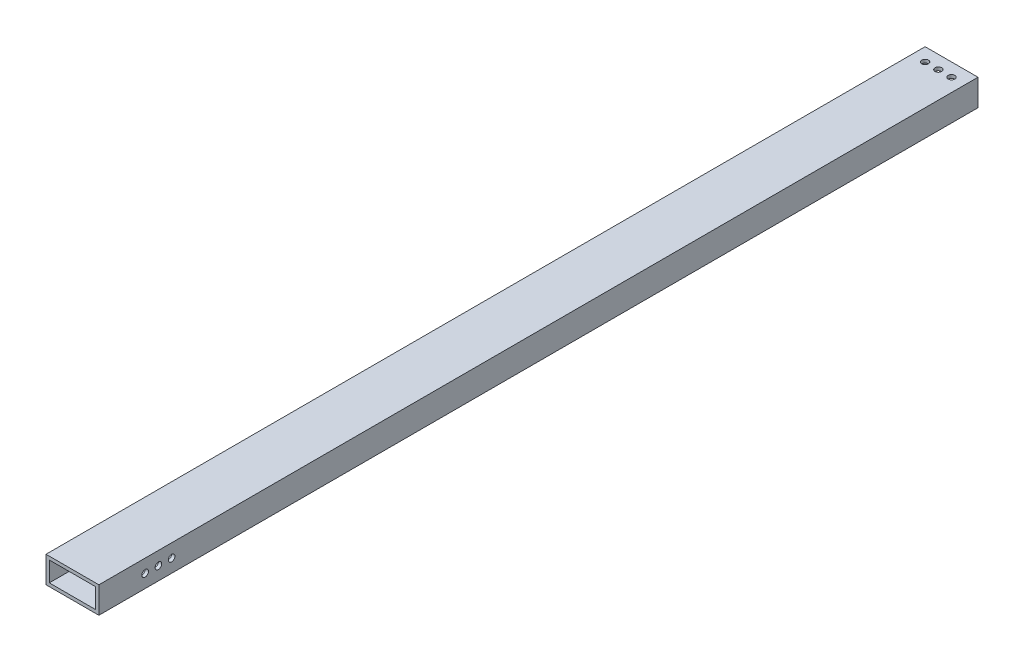
ISO-10303-21;
HEADER;
FILE_DESCRIPTION(('STEP AP214'),'2;1');
FILE_NAME('part.step','',(''),(''),'','','');
FILE_SCHEMA(('AUTOMOTIVE_DESIGN { 1 0 10303 214 1 1 1 1 }'));
ENDSEC;
DATA;
#1=APPLICATION_CONTEXT('core data for automotive mechanical design processes');
#2=APPLICATION_PROTOCOL_DEFINITION('international standard','automotive_design',2000,#1);
#3=PRODUCT_CONTEXT('',#1,'mechanical');
#4=PRODUCT('Part','Part','',(#3));
#5=PRODUCT_RELATED_PRODUCT_CATEGORY('part','',(#4));
#6=PRODUCT_DEFINITION_FORMATION('','',#4);
#7=PRODUCT_DEFINITION_CONTEXT('part definition',#1,'design');
#8=PRODUCT_DEFINITION('design','',#6,#7);
#9=PRODUCT_DEFINITION_SHAPE('','',#8);
#10=(LENGTH_UNIT() NAMED_UNIT(*) SI_UNIT(.MILLI.,.METRE.));
#11=(NAMED_UNIT(*) PLANE_ANGLE_UNIT() SI_UNIT($,.RADIAN.));
#12=(NAMED_UNIT(*) SI_UNIT($,.STERADIAN.) SOLID_ANGLE_UNIT());
#13=UNCERTAINTY_MEASURE_WITH_UNIT(LENGTH_MEASURE(1.E-05),#10,'distance_accuracy_value','');
#14=(GEOMETRIC_REPRESENTATION_CONTEXT(3) GLOBAL_UNCERTAINTY_ASSIGNED_CONTEXT((#13)) GLOBAL_UNIT_ASSIGNED_CONTEXT((#10,
#11,#12)) REPRESENTATION_CONTEXT('',''));
#15=CARTESIAN_POINT('',(0.,0.,0.));
#16=DIRECTION('',(0.,0.,1.));
#17=DIRECTION('',(1.,0.,0.));
#18=AXIS2_PLACEMENT_3D('',#15,#16,#17);
#19=CARTESIAN_POINT('',(0.,0.,844.55));
#20=DIRECTION('',(0.,0.,-1.));
#21=DIRECTION('',(-1.,0.,0.));
#22=AXIS2_PLACEMENT_3D('',#19,#20,#21);
#23=PLANE('',#22);
#24=DIRECTION('',(0.,-1.,0.));
#25=VECTOR('',#24,1.);
#26=CARTESIAN_POINT('',(0.,0.,844.55));
#27=LINE('',#26,#25);
#28=CARTESIAN_POINT('',(0.,25.4,844.55));
#29=VERTEX_POINT('',#28);
#30=CARTESIAN_POINT('',(0.,0.,844.55));
#31=VERTEX_POINT('',#30);
#32=EDGE_CURVE('E163',#29,#31,#27,.T.);
#33=ORIENTED_EDGE('',*,*,#32,.T.);
#34=DIRECTION('',(1.,0.,0.));
#35=VECTOR('',#34,1.);
#36=CARTESIAN_POINT('',(0.,0.,844.55));
#37=LINE('',#36,#35);
#38=CARTESIAN_POINT('',(50.8,0.,844.55));
#39=VERTEX_POINT('',#38);
#40=EDGE_CURVE('E167',#31,#39,#37,.T.);
#41=ORIENTED_EDGE('',*,*,#40,.T.);
#42=DIRECTION('',(0.,1.,0.));
#43=VECTOR('',#42,1.);
#44=CARTESIAN_POINT('',(50.8,0.,844.55));
#45=LINE('',#44,#43);
#46=CARTESIAN_POINT('',(50.8,25.4,844.55));
#47=VERTEX_POINT('',#46);
#48=EDGE_CURVE('E171',#39,#47,#45,.T.);
#49=ORIENTED_EDGE('',*,*,#48,.T.);
#50=DIRECTION('',(-1.,0.,0.));
#51=VECTOR('',#50,1.);
#52=CARTESIAN_POINT('',(0.,25.4,844.55));
#53=LINE('',#52,#51);
#54=EDGE_CURVE('E174',#47,#29,#53,.T.);
#55=ORIENTED_EDGE('',*,*,#54,.T.);
#56=EDGE_LOOP('',(#33,#41,#49,#55));
#57=FACE_BOUND('',#56,.T.);
#58=DIRECTION('',(0.,-1.,0.));
#59=VECTOR('',#58,1.);
#60=CARTESIAN_POINT('',(3.175,3.175,844.55));
#61=LINE('',#60,#59);
#62=CARTESIAN_POINT('',(3.175,22.225,844.55));
#63=VERTEX_POINT('',#62);
#64=CARTESIAN_POINT('',(3.175,3.175,844.55));
#65=VERTEX_POINT('',#64);
#66=EDGE_CURVE('E113',#63,#65,#61,.T.);
#67=ORIENTED_EDGE('',*,*,#66,.F.);
#68=DIRECTION('',(-1.,0.,0.));
#69=VECTOR('',#68,1.);
#70=CARTESIAN_POINT('',(3.175,22.225,844.55));
#71=LINE('',#70,#69);
#72=CARTESIAN_POINT('',(47.625,22.225,844.55));
#73=VERTEX_POINT('',#72);
#74=EDGE_CURVE('E139',#73,#63,#71,.T.);
#75=ORIENTED_EDGE('',*,*,#74,.F.);
#76=DIRECTION('',(0.,1.,0.));
#77=VECTOR('',#76,1.);
#78=CARTESIAN_POINT('',(47.625,3.175,844.55));
#79=LINE('',#78,#77);
#80=CARTESIAN_POINT('',(47.625,3.175,844.55));
#81=VERTEX_POINT('',#80);
#82=EDGE_CURVE('E135',#81,#73,#79,.T.);
#83=ORIENTED_EDGE('',*,*,#82,.F.);
#84=DIRECTION('',(1.,0.,0.));
#85=VECTOR('',#84,1.);
#86=CARTESIAN_POINT('',(3.175,3.175,844.55));
#87=LINE('',#86,#85);
#88=EDGE_CURVE('E122',#65,#81,#87,.T.);
#89=ORIENTED_EDGE('',*,*,#88,.F.);
#90=EDGE_LOOP('',(#67,#75,#83,#89));
#91=FACE_BOUND('',#90,.T.);
#92=ADVANCED_FACE('F45',(#57,#91),#23,.F.);
#93=CARTESIAN_POINT('',(0.,0.,0.));
#94=DIRECTION('',(0.,0.,-1.));
#95=DIRECTION('',(-1.,0.,0.));
#96=AXIS2_PLACEMENT_3D('',#93,#94,#95);
#97=PLANE('',#96);
#98=DIRECTION('',(0.,-1.,0.));
#99=VECTOR('',#98,1.);
#100=CARTESIAN_POINT('',(0.,0.,0.));
#101=LINE('',#100,#99);
#102=CARTESIAN_POINT('',(0.,25.4,0.));
#103=VERTEX_POINT('',#102);
#104=CARTESIAN_POINT('',(0.,0.,0.));
#105=VERTEX_POINT('',#104);
#106=EDGE_CURVE('E131',#103,#105,#101,.T.);
#107=ORIENTED_EDGE('',*,*,#106,.F.);
#108=DIRECTION('',(-1.,0.,0.));
#109=VECTOR('',#108,1.);
#110=CARTESIAN_POINT('',(0.,25.4,0.));
#111=LINE('',#110,#109);
#112=CARTESIAN_POINT('',(50.8,25.4,0.));
#113=VERTEX_POINT('',#112);
#114=EDGE_CURVE('E168',#113,#103,#111,.T.);
#115=ORIENTED_EDGE('',*,*,#114,.F.);
#116=DIRECTION('',(0.,1.,0.));
#117=VECTOR('',#116,1.);
#118=CARTESIAN_POINT('',(50.8,0.,0.));
#119=LINE('',#118,#117);
#120=CARTESIAN_POINT('',(50.8,0.,0.));
#121=VERTEX_POINT('',#120);
#122=EDGE_CURVE('E184',#121,#113,#119,.T.);
#123=ORIENTED_EDGE('',*,*,#122,.F.);
#124=DIRECTION('',(1.,0.,0.));
#125=VECTOR('',#124,1.);
#126=CARTESIAN_POINT('',(0.,0.,0.));
#127=LINE('',#126,#125);
#128=EDGE_CURVE('E181',#105,#121,#127,.T.);
#129=ORIENTED_EDGE('',*,*,#128,.F.);
#130=EDGE_LOOP('',(#107,#115,#123,#129));
#131=FACE_BOUND('',#130,.T.);
#132=DIRECTION('',(-1.,0.,0.));
#133=VECTOR('',#132,1.);
#134=CARTESIAN_POINT('',(3.175,22.225,0.));
#135=LINE('',#134,#133);
#136=CARTESIAN_POINT('',(47.625,22.225,0.));
#137=VERTEX_POINT('',#136);
#138=CARTESIAN_POINT('',(3.175,22.225,0.));
#139=VERTEX_POINT('',#138);
#140=EDGE_CURVE('E123',#137,#139,#135,.T.);
#141=ORIENTED_EDGE('',*,*,#140,.T.);
#142=DIRECTION('',(0.,-1.,0.));
#143=VECTOR('',#142,1.);
#144=CARTESIAN_POINT('',(3.175,3.175,0.));
#145=LINE('',#144,#143);
#146=CARTESIAN_POINT('',(3.175,3.175,0.));
#147=VERTEX_POINT('',#146);
#148=EDGE_CURVE('E71',#139,#147,#145,.T.);
#149=ORIENTED_EDGE('',*,*,#148,.T.);
#150=DIRECTION('',(1.,0.,0.));
#151=VECTOR('',#150,1.);
#152=CARTESIAN_POINT('',(3.175,3.175,0.));
#153=LINE('',#152,#151);
#154=CARTESIAN_POINT('',(47.625,3.175,0.));
#155=VERTEX_POINT('',#154);
#156=EDGE_CURVE('E129',#147,#155,#153,.T.);
#157=ORIENTED_EDGE('',*,*,#156,.T.);
#158=DIRECTION('',(0.,1.,0.));
#159=VECTOR('',#158,1.);
#160=CARTESIAN_POINT('',(47.625,3.175,0.));
#161=LINE('',#160,#159);
#162=EDGE_CURVE('E150',#155,#137,#161,.T.);
#163=ORIENTED_EDGE('',*,*,#162,.T.);
#164=EDGE_LOOP('',(#141,#149,#157,#163));
#165=FACE_BOUND('',#164,.T.);
#166=ADVANCED_FACE('F308',(#131,#165),#97,.T.);
#167=CARTESIAN_POINT('',(0.,0.,844.55));
#168=DIRECTION('',(1.,0.,0.));
#169=DIRECTION('',(0.,0.,-1.));
#170=AXIS2_PLACEMENT_3D('',#167,#168,#169);
#171=PLANE('',#170);
#172=CARTESIAN_POINT('',(0.,12.7,800.1));
#173=DIRECTION('',(1.,0.,0.));
#174=DIRECTION('',(0.,0.,-1.));
#175=AXIS2_PLACEMENT_3D('',#172,#173,#174);
#176=CIRCLE('',#175,3.17500000000008);
#177=CARTESIAN_POINT('',(0.,12.7,796.925));
#178=VERTEX_POINT('',#177);
#179=EDGE_CURVE('E204',#178,#178,#176,.T.);
#180=ORIENTED_EDGE('',*,*,#179,.T.);
#181=EDGE_LOOP('',(#180));
#182=FACE_BOUND('',#181,.T.);
#183=CARTESIAN_POINT('',(0.,12.7,787.4));
#184=DIRECTION('',(1.,0.,0.));
#185=DIRECTION('',(0.,0.,-1.));
#186=AXIS2_PLACEMENT_3D('',#183,#184,#185);
#187=CIRCLE('',#186,3.17500000000008);
#188=CARTESIAN_POINT('',(0.,12.7,784.225));
#189=VERTEX_POINT('',#188);
#190=EDGE_CURVE('E258',#189,#189,#187,.T.);
#191=ORIENTED_EDGE('',*,*,#190,.T.);
#192=EDGE_LOOP('',(#191));
#193=FACE_BOUND('',#192,.T.);
#194=CARTESIAN_POINT('',(0.,12.7,774.7));
#195=DIRECTION('',(1.,0.,0.));
#196=DIRECTION('',(0.,0.,-1.));
#197=AXIS2_PLACEMENT_3D('',#194,#195,#196);
#198=CIRCLE('',#197,3.17500000000008);
#199=CARTESIAN_POINT('',(0.,12.7,771.525));
#200=VERTEX_POINT('',#199);
#201=EDGE_CURVE('E254',#200,#200,#198,.T.);
#202=ORIENTED_EDGE('',*,*,#201,.T.);
#203=EDGE_LOOP('',(#202));
#204=FACE_BOUND('',#203,.T.);
#205=ORIENTED_EDGE('',*,*,#106,.T.);
#206=DIRECTION('',(0.,0.,-1.));
#207=VECTOR('',#206,1.);
#208=CARTESIAN_POINT('',(0.,0.,844.55));
#209=LINE('',#208,#207);
#210=EDGE_CURVE('E11',#31,#105,#209,.T.);
#211=ORIENTED_EDGE('',*,*,#210,.F.);
#212=ORIENTED_EDGE('',*,*,#32,.F.);
#213=DIRECTION('',(0.,0.,-1.));
#214=VECTOR('',#213,1.);
#215=CARTESIAN_POINT('',(0.,25.4,844.55));
#216=LINE('',#215,#214);
#217=EDGE_CURVE('E177',#29,#103,#216,.T.);
#218=ORIENTED_EDGE('',*,*,#217,.T.);
#219=EDGE_LOOP('',(#205,#211,#212,#218));
#220=FACE_BOUND('',#219,.T.);
#221=ADVANCED_FACE('F47',(#182,#193,#204,#220),#171,.F.);
#222=CARTESIAN_POINT('',(0.,0.,844.55));
#223=DIRECTION('',(0.,1.,0.));
#224=DIRECTION('',(0.,0.,1.));
#225=AXIS2_PLACEMENT_3D('',#222,#223,#224);
#226=PLANE('',#225);
#227=CARTESIAN_POINT('',(12.7,0.,12.7));
#228=DIRECTION('',(0.,1.,0.));
#229=DIRECTION('',(0.,0.,1.));
#230=AXIS2_PLACEMENT_3D('',#227,#228,#229);
#231=CIRCLE('',#230,3.17499999999999);
#232=CARTESIAN_POINT('',(12.7,0.,15.875));
#233=VERTEX_POINT('',#232);
#234=EDGE_CURVE('E333',#233,#233,#231,.T.);
#235=ORIENTED_EDGE('',*,*,#234,.T.);
#236=EDGE_LOOP('',(#235));
#237=FACE_BOUND('',#236,.T.);
#238=CARTESIAN_POINT('',(25.4,0.,12.7));
#239=DIRECTION('',(0.,1.,0.));
#240=DIRECTION('',(0.,0.,1.));
#241=AXIS2_PLACEMENT_3D('',#238,#239,#240);
#242=CIRCLE('',#241,3.17499999999999);
#243=CARTESIAN_POINT('',(25.4,0.,15.875));
#244=VERTEX_POINT('',#243);
#245=EDGE_CURVE('E220',#244,#244,#242,.T.);
#246=ORIENTED_EDGE('',*,*,#245,.T.);
#247=EDGE_LOOP('',(#246));
#248=FACE_BOUND('',#247,.T.);
#249=CARTESIAN_POINT('',(38.1,0.,12.7));
#250=DIRECTION('',(0.,1.,0.));
#251=DIRECTION('',(0.,0.,1.));
#252=AXIS2_PLACEMENT_3D('',#249,#250,#251);
#253=CIRCLE('',#252,3.175);
#254=CARTESIAN_POINT('',(38.1,0.,15.875));
#255=VERTEX_POINT('',#254);
#256=EDGE_CURVE('E242',#255,#255,#253,.T.);
#257=ORIENTED_EDGE('',*,*,#256,.T.);
#258=EDGE_LOOP('',(#257));
#259=FACE_BOUND('',#258,.T.);
#260=ORIENTED_EDGE('',*,*,#128,.T.);
#261=DIRECTION('',(0.,0.,-1.));
#262=VECTOR('',#261,1.);
#263=CARTESIAN_POINT('',(50.8,0.,844.55));
#264=LINE('',#263,#262);
#265=EDGE_CURVE('E55',#39,#121,#264,.T.);
#266=ORIENTED_EDGE('',*,*,#265,.F.);
#267=ORIENTED_EDGE('',*,*,#40,.F.);
#268=ORIENTED_EDGE('',*,*,#210,.T.);
#269=EDGE_LOOP('',(#260,#266,#267,#268));
#270=FACE_BOUND('',#269,.T.);
#271=ADVANCED_FACE('F324',(#237,#248,#259,#270),#226,.F.);
#272=CARTESIAN_POINT('',(50.8,0.,844.55));
#273=DIRECTION('',(-1.,0.,0.));
#274=DIRECTION('',(0.,0.,1.));
#275=AXIS2_PLACEMENT_3D('',#272,#273,#274);
#276=PLANE('',#275);
#277=CARTESIAN_POINT('',(50.8,12.7,800.1));
#278=DIRECTION('',(-1.,0.,0.));
#279=DIRECTION('',(0.,0.,1.));
#280=AXIS2_PLACEMENT_3D('',#277,#278,#279);
#281=CIRCLE('',#280,3.17500000000008);
#282=CARTESIAN_POINT('',(50.8,12.7,803.275));
#283=VERTEX_POINT('',#282);
#284=EDGE_CURVE('E147',#283,#283,#281,.T.);
#285=ORIENTED_EDGE('',*,*,#284,.T.);
#286=EDGE_LOOP('',(#285));
#287=FACE_BOUND('',#286,.T.);
#288=CARTESIAN_POINT('',(50.8,12.7,787.4));
#289=DIRECTION('',(-1.,0.,0.));
#290=DIRECTION('',(0.,0.,1.));
#291=AXIS2_PLACEMENT_3D('',#288,#289,#290);
#292=CIRCLE('',#291,3.17500000000008);
#293=CARTESIAN_POINT('',(50.8,12.7,790.575));
#294=VERTEX_POINT('',#293);
#295=EDGE_CURVE('E215',#294,#294,#292,.T.);
#296=ORIENTED_EDGE('',*,*,#295,.T.);
#297=EDGE_LOOP('',(#296));
#298=FACE_BOUND('',#297,.T.);
#299=CARTESIAN_POINT('',(50.8,12.7,774.7));
#300=DIRECTION('',(-1.,0.,0.));
#301=DIRECTION('',(0.,0.,1.));
#302=AXIS2_PLACEMENT_3D('',#299,#300,#301);
#303=CIRCLE('',#302,3.17500000000008);
#304=CARTESIAN_POINT('',(50.8,12.7,777.875));
#305=VERTEX_POINT('',#304);
#306=EDGE_CURVE('E210',#305,#305,#303,.T.);
#307=ORIENTED_EDGE('',*,*,#306,.T.);
#308=EDGE_LOOP('',(#307));
#309=FACE_BOUND('',#308,.T.);
#310=ORIENTED_EDGE('',*,*,#122,.T.);
#311=DIRECTION('',(0.,0.,-1.));
#312=VECTOR('',#311,1.);
#313=CARTESIAN_POINT('',(50.8,25.4,844.55));
#314=LINE('',#313,#312);
#315=EDGE_CURVE('E192',#47,#113,#314,.T.);
#316=ORIENTED_EDGE('',*,*,#315,.F.);
#317=ORIENTED_EDGE('',*,*,#48,.F.);
#318=ORIENTED_EDGE('',*,*,#265,.T.);
#319=EDGE_LOOP('',(#310,#316,#317,#318));
#320=FACE_BOUND('',#319,.T.);
#321=ADVANCED_FACE('F283',(#287,#298,#309,#320),#276,.F.);
#322=CARTESIAN_POINT('',(0.,25.4,844.55));
#323=DIRECTION('',(0.,-1.,0.));
#324=DIRECTION('',(0.,0.,-1.));
#325=AXIS2_PLACEMENT_3D('',#322,#323,#324);
#326=PLANE('',#325);
#327=CARTESIAN_POINT('',(12.7,25.4,12.7));
#328=DIRECTION('',(0.,1.,0.));
#329=DIRECTION('',(0.,0.,1.));
#330=AXIS2_PLACEMENT_3D('',#327,#328,#329);
#331=CIRCLE('',#330,3.175);
#332=CARTESIAN_POINT('',(12.7,25.4,15.875));
#333=VERTEX_POINT('',#332);
#334=EDGE_CURVE('E402',#333,#333,#331,.T.);
#335=ORIENTED_EDGE('',*,*,#334,.F.);
#336=EDGE_LOOP('',(#335));
#337=FACE_BOUND('',#336,.T.);
#338=CARTESIAN_POINT('',(25.4,25.4,12.7));
#339=DIRECTION('',(0.,1.,0.));
#340=DIRECTION('',(0.,0.,1.));
#341=AXIS2_PLACEMENT_3D('',#338,#339,#340);
#342=CIRCLE('',#341,3.175);
#343=CARTESIAN_POINT('',(25.4,25.4,15.875));
#344=VERTEX_POINT('',#343);
#345=EDGE_CURVE('E229',#344,#344,#342,.T.);
#346=ORIENTED_EDGE('',*,*,#345,.F.);
#347=EDGE_LOOP('',(#346));
#348=FACE_BOUND('',#347,.T.);
#349=CARTESIAN_POINT('',(38.1,25.4,12.7));
#350=DIRECTION('',(0.,1.,0.));
#351=DIRECTION('',(0.,0.,1.));
#352=AXIS2_PLACEMENT_3D('',#349,#350,#351);
#353=CIRCLE('',#352,3.175);
#354=CARTESIAN_POINT('',(38.1,25.4,15.875));
#355=VERTEX_POINT('',#354);
#356=EDGE_CURVE('E226',#355,#355,#353,.T.);
#357=ORIENTED_EDGE('',*,*,#356,.F.);
#358=EDGE_LOOP('',(#357));
#359=FACE_BOUND('',#358,.T.);
#360=ORIENTED_EDGE('',*,*,#114,.T.);
#361=ORIENTED_EDGE('',*,*,#217,.F.);
#362=ORIENTED_EDGE('',*,*,#54,.F.);
#363=ORIENTED_EDGE('',*,*,#315,.T.);
#364=EDGE_LOOP('',(#360,#361,#362,#363));
#365=FACE_BOUND('',#364,.T.);
#366=ADVANCED_FACE('F319',(#337,#348,#359,#365),#326,.F.);
#367=CARTESIAN_POINT('',(3.175,3.175,844.55));
#368=DIRECTION('',(1.,0.,0.));
#369=DIRECTION('',(0.,0.,-1.));
#370=AXIS2_PLACEMENT_3D('',#367,#368,#369);
#371=PLANE('',#370);
#372=CARTESIAN_POINT('',(3.175,12.7,800.1));
#373=DIRECTION('',(1.,0.,0.));
#374=DIRECTION('',(0.,0.,-1.));
#375=AXIS2_PLACEMENT_3D('',#372,#373,#374);
#376=CIRCLE('',#375,3.17500000000008);
#377=CARTESIAN_POINT('',(3.175,12.7,796.925));
#378=VERTEX_POINT('',#377);
#379=EDGE_CURVE('E214',#378,#378,#376,.T.);
#380=ORIENTED_EDGE('',*,*,#379,.F.);
#381=EDGE_LOOP('',(#380));
#382=FACE_BOUND('',#381,.T.);
#383=CARTESIAN_POINT('',(3.175,12.7,787.4));
#384=DIRECTION('',(1.,0.,0.));
#385=DIRECTION('',(0.,0.,-1.));
#386=AXIS2_PLACEMENT_3D('',#383,#384,#385);
#387=CIRCLE('',#386,3.17500000000008);
#388=CARTESIAN_POINT('',(3.175,12.7,784.225));
#389=VERTEX_POINT('',#388);
#390=EDGE_CURVE('E209',#389,#389,#387,.T.);
#391=ORIENTED_EDGE('',*,*,#390,.F.);
#392=EDGE_LOOP('',(#391));
#393=FACE_BOUND('',#392,.T.);
#394=CARTESIAN_POINT('',(3.175,12.7,774.7));
#395=DIRECTION('',(1.,0.,0.));
#396=DIRECTION('',(0.,0.,-1.));
#397=AXIS2_PLACEMENT_3D('',#394,#395,#396);
#398=CIRCLE('',#397,3.17500000000008);
#399=CARTESIAN_POINT('',(3.175,12.7,771.525));
#400=VERTEX_POINT('',#399);
#401=EDGE_CURVE('E203',#400,#400,#398,.T.);
#402=ORIENTED_EDGE('',*,*,#401,.F.);
#403=EDGE_LOOP('',(#402));
#404=FACE_BOUND('',#403,.T.);
#405=ORIENTED_EDGE('',*,*,#148,.F.);
#406=DIRECTION('',(0.,0.,-1.));
#407=VECTOR('',#406,1.);
#408=CARTESIAN_POINT('',(3.175,22.225,844.55));
#409=LINE('',#408,#407);
#410=EDGE_CURVE('E117',#63,#139,#409,.T.);
#411=ORIENTED_EDGE('',*,*,#410,.F.);
#412=ORIENTED_EDGE('',*,*,#66,.T.);
#413=DIRECTION('',(0.,0.,-1.));
#414=VECTOR('',#413,1.);
#415=CARTESIAN_POINT('',(3.175,3.175,844.55));
#416=LINE('',#415,#414);
#417=EDGE_CURVE('E116',#65,#147,#416,.T.);
#418=ORIENTED_EDGE('',*,*,#417,.T.);
#419=EDGE_LOOP('',(#405,#411,#412,#418));
#420=FACE_BOUND('',#419,.T.);
#421=ADVANCED_FACE('F115',(#382,#393,#404,#420),#371,.T.);
#422=CARTESIAN_POINT('',(3.175,3.175,844.55));
#423=DIRECTION('',(0.,1.,0.));
#424=DIRECTION('',(0.,0.,1.));
#425=AXIS2_PLACEMENT_3D('',#422,#423,#424);
#426=PLANE('',#425);
#427=CARTESIAN_POINT('',(12.7,3.175,12.7));
#428=DIRECTION('',(0.,1.,0.));
#429=DIRECTION('',(0.,0.,1.));
#430=AXIS2_PLACEMENT_3D('',#427,#428,#429);
#431=CIRCLE('',#430,3.175);
#432=CARTESIAN_POINT('',(12.7,3.175,15.875));
#433=VERTEX_POINT('',#432);
#434=EDGE_CURVE('E49',#433,#433,#431,.T.);
#435=ORIENTED_EDGE('',*,*,#434,.F.);
#436=EDGE_LOOP('',(#435));
#437=FACE_BOUND('',#436,.T.);
#438=CARTESIAN_POINT('',(25.4,3.175,12.7));
#439=DIRECTION('',(0.,1.,0.));
#440=DIRECTION('',(0.,0.,1.));
#441=AXIS2_PLACEMENT_3D('',#438,#439,#440);
#442=CIRCLE('',#441,3.175);
#443=CARTESIAN_POINT('',(25.4,3.175,15.875));
#444=VERTEX_POINT('',#443);
#445=EDGE_CURVE('E216',#444,#444,#442,.T.);
#446=ORIENTED_EDGE('',*,*,#445,.F.);
#447=EDGE_LOOP('',(#446));
#448=FACE_BOUND('',#447,.T.);
#449=CARTESIAN_POINT('',(38.1,3.175,12.7));
#450=DIRECTION('',(0.,1.,0.));
#451=DIRECTION('',(0.,0.,1.));
#452=AXIS2_PLACEMENT_3D('',#449,#450,#451);
#453=CIRCLE('',#452,3.175);
#454=CARTESIAN_POINT('',(38.1,3.175,15.875));
#455=VERTEX_POINT('',#454);
#456=EDGE_CURVE('E250',#455,#455,#453,.T.);
#457=ORIENTED_EDGE('',*,*,#456,.F.);
#458=EDGE_LOOP('',(#457));
#459=FACE_BOUND('',#458,.T.);
#460=ORIENTED_EDGE('',*,*,#156,.F.);
#461=ORIENTED_EDGE('',*,*,#417,.F.);
#462=ORIENTED_EDGE('',*,*,#88,.T.);
#463=DIRECTION('',(0.,0.,-1.));
#464=VECTOR('',#463,1.);
#465=CARTESIAN_POINT('',(47.625,3.175,844.55));
#466=LINE('',#465,#464);
#467=EDGE_CURVE('E132',#81,#155,#466,.T.);
#468=ORIENTED_EDGE('',*,*,#467,.T.);
#469=EDGE_LOOP('',(#460,#461,#462,#468));
#470=FACE_BOUND('',#469,.T.);
#471=ADVANCED_FACE('F126',(#437,#448,#459,#470),#426,.T.);
#472=CARTESIAN_POINT('',(47.625,3.175,844.55));
#473=DIRECTION('',(-1.,0.,0.));
#474=DIRECTION('',(0.,0.,1.));
#475=AXIS2_PLACEMENT_3D('',#472,#473,#474);
#476=PLANE('',#475);
#477=CARTESIAN_POINT('',(47.625,12.7,800.1));
#478=DIRECTION('',(-1.,0.,0.));
#479=DIRECTION('',(0.,0.,1.));
#480=AXIS2_PLACEMENT_3D('',#477,#478,#479);
#481=CIRCLE('',#480,3.17500000000008);
#482=CARTESIAN_POINT('',(47.625,12.7,803.275));
#483=VERTEX_POINT('',#482);
#484=EDGE_CURVE('E211',#483,#483,#481,.T.);
#485=ORIENTED_EDGE('',*,*,#484,.F.);
#486=EDGE_LOOP('',(#485));
#487=FACE_BOUND('',#486,.T.);
#488=CARTESIAN_POINT('',(47.625,12.7,787.4));
#489=DIRECTION('',(-1.,0.,0.));
#490=DIRECTION('',(0.,0.,1.));
#491=AXIS2_PLACEMENT_3D('',#488,#489,#490);
#492=CIRCLE('',#491,3.17500000000008);
#493=CARTESIAN_POINT('',(47.625,12.7,790.575));
#494=VERTEX_POINT('',#493);
#495=EDGE_CURVE('E205',#494,#494,#492,.T.);
#496=ORIENTED_EDGE('',*,*,#495,.F.);
#497=EDGE_LOOP('',(#496));
#498=FACE_BOUND('',#497,.T.);
#499=CARTESIAN_POINT('',(47.625,12.7,774.7));
#500=DIRECTION('',(-1.,0.,0.));
#501=DIRECTION('',(0.,0.,1.));
#502=AXIS2_PLACEMENT_3D('',#499,#500,#501);
#503=CIRCLE('',#502,3.17500000000008);
#504=CARTESIAN_POINT('',(47.625,12.7,777.875));
#505=VERTEX_POINT('',#504);
#506=EDGE_CURVE('E199',#505,#505,#503,.T.);
#507=ORIENTED_EDGE('',*,*,#506,.F.);
#508=EDGE_LOOP('',(#507));
#509=FACE_BOUND('',#508,.T.);
#510=ORIENTED_EDGE('',*,*,#162,.F.);
#511=ORIENTED_EDGE('',*,*,#467,.F.);
#512=ORIENTED_EDGE('',*,*,#82,.T.);
#513=DIRECTION('',(0.,0.,-1.));
#514=VECTOR('',#513,1.);
#515=CARTESIAN_POINT('',(47.625,22.225,844.55));
#516=LINE('',#515,#514);
#517=EDGE_CURVE('E63',#73,#137,#516,.T.);
#518=ORIENTED_EDGE('',*,*,#517,.T.);
#519=EDGE_LOOP('',(#510,#511,#512,#518));
#520=FACE_BOUND('',#519,.T.);
#521=ADVANCED_FACE('F354',(#487,#498,#509,#520),#476,.T.);
#522=CARTESIAN_POINT('',(3.175,22.225,844.55));
#523=DIRECTION('',(0.,-1.,0.));
#524=DIRECTION('',(0.,0.,-1.));
#525=AXIS2_PLACEMENT_3D('',#522,#523,#524);
#526=PLANE('',#525);
#527=CARTESIAN_POINT('',(12.7,22.225,12.7));
#528=DIRECTION('',(0.,-1.,0.));
#529=DIRECTION('',(0.,0.,-1.));
#530=AXIS2_PLACEMENT_3D('',#527,#528,#529);
#531=CIRCLE('',#530,3.175);
#532=CARTESIAN_POINT('',(12.7,22.225,9.52500000000005));
#533=VERTEX_POINT('',#532);
#534=EDGE_CURVE('E235',#533,#533,#531,.T.);
#535=ORIENTED_EDGE('',*,*,#534,.F.);
#536=EDGE_LOOP('',(#535));
#537=FACE_BOUND('',#536,.T.);
#538=CARTESIAN_POINT('',(25.4,22.225,12.7));
#539=DIRECTION('',(0.,-1.,0.));
#540=DIRECTION('',(0.,0.,-1.));
#541=AXIS2_PLACEMENT_3D('',#538,#539,#540);
#542=CIRCLE('',#541,3.175);
#543=CARTESIAN_POINT('',(25.4,22.225,9.52500000000005));
#544=VERTEX_POINT('',#543);
#545=EDGE_CURVE('E219',#544,#544,#542,.T.);
#546=ORIENTED_EDGE('',*,*,#545,.F.);
#547=EDGE_LOOP('',(#546));
#548=FACE_BOUND('',#547,.T.);
#549=CARTESIAN_POINT('',(38.1,22.225,12.7));
#550=DIRECTION('',(0.,-1.,0.));
#551=DIRECTION('',(0.,0.,-1.));
#552=AXIS2_PLACEMENT_3D('',#549,#550,#551);
#553=CIRCLE('',#552,3.175);
#554=CARTESIAN_POINT('',(38.1,22.225,9.525));
#555=VERTEX_POINT('',#554);
#556=EDGE_CURVE('E246',#555,#555,#553,.T.);
#557=ORIENTED_EDGE('',*,*,#556,.F.);
#558=EDGE_LOOP('',(#557));
#559=FACE_BOUND('',#558,.T.);
#560=ORIENTED_EDGE('',*,*,#140,.F.);
#561=ORIENTED_EDGE('',*,*,#517,.F.);
#562=ORIENTED_EDGE('',*,*,#74,.T.);
#563=ORIENTED_EDGE('',*,*,#410,.T.);
#564=EDGE_LOOP('',(#560,#561,#562,#563));
#565=FACE_BOUND('',#564,.T.);
#566=ADVANCED_FACE('F352',(#537,#548,#559,#565),#526,.T.);
#567=CARTESIAN_POINT('',(0.,12.7,774.7));
#568=DIRECTION('',(1.,0.,0.));
#569=DIRECTION('',(0.,0.,-1.));
#570=AXIS2_PLACEMENT_3D('',#567,#568,#569);
#571=CYLINDRICAL_SURFACE('',#570,3.17500000000008);
#572=ORIENTED_EDGE('',*,*,#506,.T.);
#573=EDGE_LOOP('',(#572));
#574=FACE_BOUND('',#573,.T.);
#575=ORIENTED_EDGE('',*,*,#306,.F.);
#576=EDGE_LOOP('',(#575));
#577=FACE_BOUND('',#576,.T.);
#578=ADVANCED_FACE('F300',(#574,#577),#571,.F.);
#579=CARTESIAN_POINT('',(0.,12.7,787.4));
#580=DIRECTION('',(1.,0.,0.));
#581=DIRECTION('',(0.,0.,-1.));
#582=AXIS2_PLACEMENT_3D('',#579,#580,#581);
#583=CYLINDRICAL_SURFACE('',#582,3.17500000000008);
#584=ORIENTED_EDGE('',*,*,#495,.T.);
#585=EDGE_LOOP('',(#584));
#586=FACE_BOUND('',#585,.T.);
#587=ORIENTED_EDGE('',*,*,#295,.F.);
#588=EDGE_LOOP('',(#587));
#589=FACE_BOUND('',#588,.T.);
#590=ADVANCED_FACE('F289',(#586,#589),#583,.F.);
#591=CARTESIAN_POINT('',(0.,12.7,800.1));
#592=DIRECTION('',(1.,0.,0.));
#593=DIRECTION('',(0.,0.,-1.));
#594=AXIS2_PLACEMENT_3D('',#591,#592,#593);
#595=CYLINDRICAL_SURFACE('',#594,3.17500000000008);
#596=ORIENTED_EDGE('',*,*,#484,.T.);
#597=EDGE_LOOP('',(#596));
#598=FACE_BOUND('',#597,.T.);
#599=ORIENTED_EDGE('',*,*,#284,.F.);
#600=EDGE_LOOP('',(#599));
#601=FACE_BOUND('',#600,.T.);
#602=ADVANCED_FACE('F286',(#598,#601),#595,.F.);
#603=ORIENTED_EDGE('',*,*,#401,.T.);
#604=EDGE_LOOP('',(#603));
#605=FACE_BOUND('',#604,.T.);
#606=ORIENTED_EDGE('',*,*,#201,.F.);
#607=EDGE_LOOP('',(#606));
#608=FACE_BOUND('',#607,.T.);
#609=ADVANCED_FACE('F288',(#605,#608),#571,.F.);
#610=ORIENTED_EDGE('',*,*,#390,.T.);
#611=EDGE_LOOP('',(#610));
#612=FACE_BOUND('',#611,.T.);
#613=ORIENTED_EDGE('',*,*,#190,.F.);
#614=EDGE_LOOP('',(#613));
#615=FACE_BOUND('',#614,.T.);
#616=ADVANCED_FACE('F297',(#612,#615),#583,.F.);
#617=ORIENTED_EDGE('',*,*,#379,.T.);
#618=EDGE_LOOP('',(#617));
#619=FACE_BOUND('',#618,.T.);
#620=ORIENTED_EDGE('',*,*,#179,.F.);
#621=EDGE_LOOP('',(#620));
#622=FACE_BOUND('',#621,.T.);
#623=ADVANCED_FACE('F292',(#619,#622),#595,.F.);
#624=CARTESIAN_POINT('',(38.1,25.4,12.7));
#625=DIRECTION('',(0.,1.,0.));
#626=DIRECTION('',(0.,0.,1.));
#627=AXIS2_PLACEMENT_3D('',#624,#625,#626);
#628=CYLINDRICAL_SURFACE('',#627,3.175);
#629=ORIENTED_EDGE('',*,*,#556,.T.);
#630=EDGE_LOOP('',(#629));
#631=FACE_BOUND('',#630,.T.);
#632=ORIENTED_EDGE('',*,*,#356,.T.);
#633=EDGE_LOOP('',(#632));
#634=FACE_BOUND('',#633,.T.);
#635=ADVANCED_FACE('F305',(#631,#634),#628,.F.);
#636=ORIENTED_EDGE('',*,*,#456,.T.);
#637=EDGE_LOOP('',(#636));
#638=FACE_BOUND('',#637,.T.);
#639=ORIENTED_EDGE('',*,*,#256,.F.);
#640=EDGE_LOOP('',(#639));
#641=FACE_BOUND('',#640,.T.);
#642=ADVANCED_FACE('F379',(#638,#641),#628,.F.);
#643=CARTESIAN_POINT('',(25.4,25.4,12.7));
#644=DIRECTION('',(0.,1.,0.));
#645=DIRECTION('',(0.,0.,1.));
#646=AXIS2_PLACEMENT_3D('',#643,#644,#645);
#647=CYLINDRICAL_SURFACE('',#646,3.175);
#648=ORIENTED_EDGE('',*,*,#445,.T.);
#649=EDGE_LOOP('',(#648));
#650=FACE_BOUND('',#649,.T.);
#651=ORIENTED_EDGE('',*,*,#245,.F.);
#652=EDGE_LOOP('',(#651));
#653=FACE_BOUND('',#652,.T.);
#654=ADVANCED_FACE('F382',(#650,#653),#647,.F.);
#655=ORIENTED_EDGE('',*,*,#545,.T.);
#656=EDGE_LOOP('',(#655));
#657=FACE_BOUND('',#656,.T.);
#658=ORIENTED_EDGE('',*,*,#345,.T.);
#659=EDGE_LOOP('',(#658));
#660=FACE_BOUND('',#659,.T.);
#661=ADVANCED_FACE('F386',(#657,#660),#647,.F.);
#662=CARTESIAN_POINT('',(12.7,25.4,12.7));
#663=DIRECTION('',(0.,1.,0.));
#664=DIRECTION('',(0.,0.,1.));
#665=AXIS2_PLACEMENT_3D('',#662,#663,#664);
#666=CYLINDRICAL_SURFACE('',#665,3.175);
#667=ORIENTED_EDGE('',*,*,#434,.T.);
#668=EDGE_LOOP('',(#667));
#669=FACE_BOUND('',#668,.T.);
#670=ORIENTED_EDGE('',*,*,#234,.F.);
#671=EDGE_LOOP('',(#670));
#672=FACE_BOUND('',#671,.T.);
#673=ADVANCED_FACE('F390',(#669,#672),#666,.F.);
#674=ORIENTED_EDGE('',*,*,#534,.T.);
#675=EDGE_LOOP('',(#674));
#676=FACE_BOUND('',#675,.T.);
#677=ORIENTED_EDGE('',*,*,#334,.T.);
#678=EDGE_LOOP('',(#677));
#679=FACE_BOUND('',#678,.T.);
#680=ADVANCED_FACE('F392',(#676,#679),#666,.F.);
#681=CLOSED_SHELL('',(#92,#166,#221,#271,#321,#366,#421,#471,#521,#566,#578,#590,#602,#609,#616,
#623,#635,#642,#654,#661,#673,#680));
#682=MANIFOLD_SOLID_BREP('B2',#681);
#683=ADVANCED_BREP_SHAPE_REPRESENTATION('',(#18,#682),#14);
#684=SHAPE_DEFINITION_REPRESENTATION(#9,#683);
ENDSEC;
END-ISO-10303-21;
